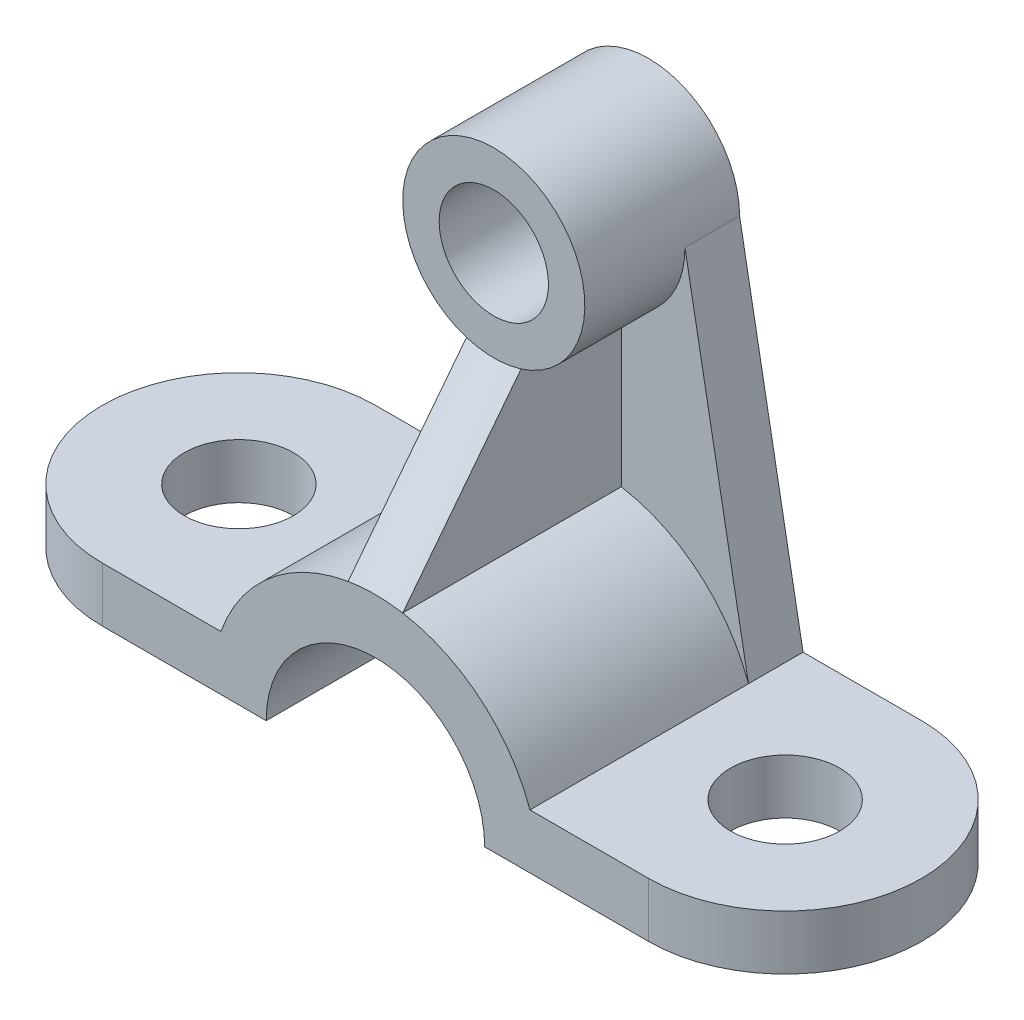
ISO-10303-21;
HEADER;
FILE_DESCRIPTION(('STEP AP214'),'2;1');
FILE_NAME('part.step','',(''),(''),'','','');
FILE_SCHEMA(('AUTOMOTIVE_DESIGN { 1 0 10303 214 1 1 1 1 }'));
ENDSEC;
DATA;
#1=APPLICATION_CONTEXT('core data for automotive mechanical design processes');
#2=APPLICATION_PROTOCOL_DEFINITION('international standard','automotive_design',2000,#1);
#3=PRODUCT_CONTEXT('',#1,'mechanical');
#4=PRODUCT('Part','Part','',(#3));
#5=PRODUCT_RELATED_PRODUCT_CATEGORY('part','',(#4));
#6=PRODUCT_DEFINITION_FORMATION('','',#4);
#7=PRODUCT_DEFINITION_CONTEXT('part definition',#1,'design');
#8=PRODUCT_DEFINITION('design','',#6,#7);
#9=PRODUCT_DEFINITION_SHAPE('','',#8);
#10=(LENGTH_UNIT() NAMED_UNIT(*) SI_UNIT(.MILLI.,.METRE.));
#11=(NAMED_UNIT(*) PLANE_ANGLE_UNIT() SI_UNIT($,.RADIAN.));
#12=(NAMED_UNIT(*) SI_UNIT($,.STERADIAN.) SOLID_ANGLE_UNIT());
#13=UNCERTAINTY_MEASURE_WITH_UNIT(LENGTH_MEASURE(1.E-05),#10,'distance_accuracy_value','');
#14=(GEOMETRIC_REPRESENTATION_CONTEXT(3) GLOBAL_UNCERTAINTY_ASSIGNED_CONTEXT((#13)) GLOBAL_UNIT_ASSIGNED_CONTEXT((#10,
#11,#12)) REPRESENTATION_CONTEXT('',''));
#15=CARTESIAN_POINT('',(0.,0.,0.));
#16=DIRECTION('',(0.,0.,1.));
#17=DIRECTION('',(1.,0.,0.));
#18=AXIS2_PLACEMENT_3D('',#15,#16,#17);
#19=CARTESIAN_POINT('',(0.,0.,-30.));
#20=DIRECTION('',(0.,0.,1.));
#21=DIRECTION('',(1.,0.,0.));
#22=AXIS2_PLACEMENT_3D('',#19,#20,#21);
#23=CYLINDRICAL_SURFACE('',#22,36.);
#24=DIRECTION('',(0.,0.,-1.));
#25=VECTOR('',#24,1.);
#26=CARTESIAN_POINT('',(6.00000000000001,35.4964786985977,39.5135616599253));
#27=LINE('',#26,#25);
#28=CARTESIAN_POINT('',(6.00000000000001,35.4964786985977,4.));
#29=VERTEX_POINT('',#28);
#30=CARTESIAN_POINT('',(6.00000000000001,35.4964786985977,-18.));
#31=VERTEX_POINT('',#30);
#32=EDGE_CURVE('E225',#29,#31,#27,.T.);
#33=ORIENTED_EDGE('',*,*,#32,.F.);
#34=DIRECTION('',(0.,0.,1.));
#35=VECTOR('',#34,1.);
#36=CARTESIAN_POINT('',(6.00000000000001,35.4964786985977,-30.));
#37=LINE('',#36,#35);
#38=CARTESIAN_POINT('',(6.00000000000001,35.4964786985977,30.));
#39=VERTEX_POINT('',#38);
#40=EDGE_CURVE('E12',#29,#39,#37,.T.);
#41=ORIENTED_EDGE('',*,*,#40,.T.);
#42=CARTESIAN_POINT('',(0.,0.,30.));
#43=DIRECTION('',(0.,0.,1.));
#44=DIRECTION('',(1.,0.,0.));
#45=AXIS2_PLACEMENT_3D('',#42,#43,#44);
#46=CIRCLE('',#45,36.);
#47=CARTESIAN_POINT('',(33.9411254969543,12.,30.));
#48=VERTEX_POINT('',#47);
#49=EDGE_CURVE('E302',#48,#39,#46,.T.);
#50=ORIENTED_EDGE('',*,*,#49,.F.);
#51=DIRECTION('',(0.,0.,1.));
#52=VECTOR('',#51,1.);
#53=CARTESIAN_POINT('',(33.9411254969543,12.,-30.));
#54=LINE('',#53,#52);
#55=CARTESIAN_POINT('',(33.9411254969543,12.,-18.));
#56=VERTEX_POINT('',#55);
#57=EDGE_CURVE('E293',#56,#48,#54,.T.);
#58=ORIENTED_EDGE('',*,*,#57,.F.);
#59=CARTESIAN_POINT('',(0.,0.,-18.));
#60=DIRECTION('',(0.,0.,-1.));
#61=DIRECTION('',(-1.,0.,0.));
#62=AXIS2_PLACEMENT_3D('',#59,#60,#61);
#63=CIRCLE('',#62,36.);
#64=EDGE_CURVE('E263',#31,#56,#63,.T.);
#65=ORIENTED_EDGE('',*,*,#64,.F.);
#66=EDGE_LOOP('',(#33,#41,#50,#58,#65));
#67=FACE_BOUND('',#66,.T.);
#68=ADVANCED_FACE('F65',(#67),#23,.T.);
#69=CARTESIAN_POINT('',(-5.99999999999999,35.4964786985977,30.));
#70=VERTEX_POINT('',#69);
#71=CARTESIAN_POINT('',(-33.9411254969543,12.,30.));
#72=VERTEX_POINT('',#71);
#73=EDGE_CURVE('E286',#70,#72,#46,.T.);
#74=ORIENTED_EDGE('',*,*,#73,.F.);
#75=DIRECTION('',(0.,0.,1.));
#76=VECTOR('',#75,1.);
#77=CARTESIAN_POINT('',(-5.99999999999999,35.4964786985977,-30.));
#78=LINE('',#77,#76);
#79=CARTESIAN_POINT('',(-5.99999999999999,35.4964786985977,4.));
#80=VERTEX_POINT('',#79);
#81=EDGE_CURVE('E76',#70,#80,#78,.F.);
#82=ORIENTED_EDGE('',*,*,#81,.T.);
#83=DIRECTION('',(0.,0.,-1.));
#84=VECTOR('',#83,1.);
#85=CARTESIAN_POINT('',(-5.99999999999999,35.4964786985977,39.5135616599253));
#86=LINE('',#85,#84);
#87=CARTESIAN_POINT('',(-5.99999999999999,35.4964786985977,-18.));
#88=VERTEX_POINT('',#87);
#89=EDGE_CURVE('E218',#80,#88,#86,.T.);
#90=ORIENTED_EDGE('',*,*,#89,.T.);
#91=CARTESIAN_POINT('',(-33.9411254969543,12.,-18.));
#92=VERTEX_POINT('',#91);
#93=EDGE_CURVE('E191',#92,#88,#63,.T.);
#94=ORIENTED_EDGE('',*,*,#93,.F.);
#95=DIRECTION('',(0.,0.,1.));
#96=VECTOR('',#95,1.);
#97=CARTESIAN_POINT('',(-33.9411254969543,12.,-30.));
#98=LINE('',#97,#96);
#99=EDGE_CURVE('E694',#92,#72,#98,.T.);
#100=ORIENTED_EDGE('',*,*,#99,.T.);
#101=EDGE_LOOP('',(#74,#82,#90,#94,#100));
#102=FACE_BOUND('',#101,.T.);
#103=ADVANCED_FACE('F385',(#102),#23,.T.);
#104=CARTESIAN_POINT('',(0.,0.,-18.));
#105=DIRECTION('',(0.,0.,-1.));
#106=DIRECTION('',(-1.,0.,0.));
#107=AXIS2_PLACEMENT_3D('',#104,#105,#106);
#108=PLANE('',#107);
#109=DIRECTION('',(0.,1.,0.));
#110=VECTOR('',#109,1.);
#111=CARTESIAN_POINT('',(6.,68.9212159716611,-18.));
#112=LINE('',#111,#110);
#113=CARTESIAN_POINT('',(6.,68.9212159716611,-18.));
#114=VERTEX_POINT('',#113);
#115=EDGE_CURVE('E85',#31,#114,#112,.T.);
#116=ORIENTED_EDGE('',*,*,#115,.F.);
#117=ORIENTED_EDGE('',*,*,#64,.T.);
#118=DIRECTION('',(-0.180425434485843,0.98358866534268,0.));
#119=VECTOR('',#118,1.);
#120=CARTESIAN_POINT('',(34.9658015341946,6.41398193802372,-18.));
#121=LINE('',#120,#119);
#122=CARTESIAN_POINT('',(20.,88.,-18.));
#123=VERTEX_POINT('',#122);
#124=EDGE_CURVE('E259',#56,#123,#121,.T.);
#125=ORIENTED_EDGE('',*,*,#124,.T.);
#126=CARTESIAN_POINT('',(0.,88.,-18.));
#127=DIRECTION('',(0.,0.,-1.));
#128=DIRECTION('',(-1.,0.,0.));
#129=AXIS2_PLACEMENT_3D('',#126,#127,#128);
#130=CIRCLE('',#129,20.);
#131=EDGE_CURVE('E207',#123,#114,#130,.T.);
#132=ORIENTED_EDGE('',*,*,#131,.T.);
#133=EDGE_LOOP('',(#116,#117,#125,#132));
#134=FACE_BOUND('',#133,.T.);
#135=ADVANCED_FACE('F399',(#134),#108,.F.);
#136=DIRECTION('',(0.,-1.,0.));
#137=VECTOR('',#136,1.);
#138=CARTESIAN_POINT('',(-5.99999999999999,35.4964786985977,-18.));
#139=LINE('',#138,#137);
#140=CARTESIAN_POINT('',(-6.,68.9212159716611,-18.));
#141=VERTEX_POINT('',#140);
#142=EDGE_CURVE('E185',#141,#88,#139,.T.);
#143=ORIENTED_EDGE('',*,*,#142,.F.);
#144=CARTESIAN_POINT('',(-20.,88.,-18.));
#145=VERTEX_POINT('',#144);
#146=EDGE_CURVE('E189',#141,#145,#130,.T.);
#147=ORIENTED_EDGE('',*,*,#146,.T.);
#148=DIRECTION('',(0.180425434485843,0.98358866534268,0.));
#149=VECTOR('',#148,1.);
#150=CARTESIAN_POINT('',(-34.9658015341946,6.41398193802373,-18.));
#151=LINE('',#150,#149);
#152=EDGE_CURVE('E266',#92,#145,#151,.T.);
#153=ORIENTED_EDGE('',*,*,#152,.F.);
#154=ORIENTED_EDGE('',*,*,#93,.T.);
#155=EDGE_LOOP('',(#143,#147,#153,#154));
#156=FACE_BOUND('',#155,.T.);
#157=ADVANCED_FACE('F187',(#156),#108,.F.);
#158=CARTESIAN_POINT('',(0.,88.,4.));
#159=DIRECTION('',(0.,0.,-1.));
#160=DIRECTION('',(-1.,0.,0.));
#161=AXIS2_PLACEMENT_3D('',#158,#159,#160);
#162=CYLINDRICAL_SURFACE('',#161,20.);
#163=CARTESIAN_POINT('',(0.,88.,4.));
#164=DIRECTION('',(0.,0.,-1.));
#165=DIRECTION('',(-1.,0.,0.));
#166=AXIS2_PLACEMENT_3D('',#163,#164,#165);
#167=CIRCLE('',#166,20.);
#168=CARTESIAN_POINT('',(-6.,68.9212159716611,4.));
#169=VERTEX_POINT('',#168);
#170=CARTESIAN_POINT('',(6.,68.9212159716611,4.));
#171=VERTEX_POINT('',#170);
#172=EDGE_CURVE('E253',#169,#171,#167,.T.);
#173=ORIENTED_EDGE('',*,*,#172,.T.);
#174=DIRECTION('',(0.,0.,-1.));
#175=VECTOR('',#174,1.);
#176=CARTESIAN_POINT('',(6.,68.9212159716611,39.5135616599253));
#177=LINE('',#176,#175);
#178=EDGE_CURVE('E233',#171,#114,#177,.T.);
#179=ORIENTED_EDGE('',*,*,#178,.T.);
#180=ORIENTED_EDGE('',*,*,#131,.F.);
#181=DIRECTION('',(0.,0.,-1.));
#182=VECTOR('',#181,1.);
#183=CARTESIAN_POINT('',(20.,88.,-18.));
#184=LINE('',#183,#182);
#185=CARTESIAN_POINT('',(20.,88.,-30.));
#186=VERTEX_POINT('',#185);
#187=EDGE_CURVE('E269',#123,#186,#184,.T.);
#188=ORIENTED_EDGE('',*,*,#187,.T.);
#189=CARTESIAN_POINT('',(0.,88.,-30.));
#190=DIRECTION('',(0.,0.,-1.));
#191=DIRECTION('',(-1.,0.,0.));
#192=AXIS2_PLACEMENT_3D('',#189,#190,#191);
#193=CIRCLE('',#192,20.);
#194=CARTESIAN_POINT('',(-20.,88.,-30.));
#195=VERTEX_POINT('',#194);
#196=EDGE_CURVE('E223',#195,#186,#193,.T.);
#197=ORIENTED_EDGE('',*,*,#196,.F.);
#198=DIRECTION('',(0.,0.,-1.));
#199=VECTOR('',#198,1.);
#200=CARTESIAN_POINT('',(-20.,88.,-18.));
#201=LINE('',#200,#199);
#202=EDGE_CURVE('E204',#145,#195,#201,.T.);
#203=ORIENTED_EDGE('',*,*,#202,.F.);
#204=ORIENTED_EDGE('',*,*,#146,.F.);
#205=DIRECTION('',(0.,0.,-1.));
#206=VECTOR('',#205,1.);
#207=CARTESIAN_POINT('',(-6.,68.9212159716611,39.5135616599253));
#208=LINE('',#207,#206);
#209=EDGE_CURVE('E202',#169,#141,#208,.T.);
#210=ORIENTED_EDGE('',*,*,#209,.F.);
#211=EDGE_LOOP('',(#173,#179,#180,#188,#197,#203,#204,#210));
#212=FACE_BOUND('',#211,.T.);
#213=ADVANCED_FACE('F201',(#212),#162,.T.);
#214=CARTESIAN_POINT('',(-60.,0.,0.));
#215=DIRECTION('',(0.,1.,0.));
#216=DIRECTION('',(0.,0.,1.));
#217=AXIS2_PLACEMENT_3D('',#214,#215,#216);
#218=PLANE('',#217);
#219=CARTESIAN_POINT('',(-60.,0.,0.));
#220=DIRECTION('',(0.,1.,0.));
#221=DIRECTION('',(0.,0.,1.));
#222=AXIS2_PLACEMENT_3D('',#219,#220,#221);
#223=CIRCLE('',#222,12.);
#224=CARTESIAN_POINT('',(-60.,0.,12.));
#225=VERTEX_POINT('',#224);
#226=EDGE_CURVE('E681',#225,#225,#223,.T.);
#227=ORIENTED_EDGE('',*,*,#226,.T.);
#228=EDGE_LOOP('',(#227));
#229=FACE_BOUND('',#228,.T.);
#230=DIRECTION('',(-1.,0.,0.));
#231=VECTOR('',#230,1.);
#232=CARTESIAN_POINT('',(0.,0.,-30.));
#233=LINE('',#232,#231);
#234=CARTESIAN_POINT('',(-24.,0.,-30.));
#235=VERTEX_POINT('',#234);
#236=CARTESIAN_POINT('',(-60.,0.,-30.));
#237=VERTEX_POINT('',#236);
#238=EDGE_CURVE('E501',#235,#237,#233,.T.);
#239=ORIENTED_EDGE('',*,*,#238,.F.);
#240=DIRECTION('',(0.,0.,1.));
#241=VECTOR('',#240,1.);
#242=CARTESIAN_POINT('',(-24.,0.,-30.));
#243=LINE('',#242,#241);
#244=CARTESIAN_POINT('',(-24.,0.,30.));
#245=VERTEX_POINT('',#244);
#246=EDGE_CURVE('E282',#235,#245,#243,.T.);
#247=ORIENTED_EDGE('',*,*,#246,.T.);
#248=DIRECTION('',(1.,0.,0.));
#249=VECTOR('',#248,1.);
#250=CARTESIAN_POINT('',(0.,0.,30.));
#251=LINE('',#250,#249);
#252=CARTESIAN_POINT('',(-60.,0.,30.));
#253=VERTEX_POINT('',#252);
#254=EDGE_CURVE('E494',#253,#245,#251,.T.);
#255=ORIENTED_EDGE('',*,*,#254,.F.);
#256=CARTESIAN_POINT('',(-60.,0.,0.));
#257=DIRECTION('',(0.,1.,0.));
#258=DIRECTION('',(0.,0.,1.));
#259=AXIS2_PLACEMENT_3D('',#256,#257,#258);
#260=CIRCLE('',#259,30.);
#261=EDGE_CURVE('E488',#237,#253,#260,.T.);
#262=ORIENTED_EDGE('',*,*,#261,.F.);
#263=EDGE_LOOP('',(#239,#247,#255,#262));
#264=FACE_BOUND('',#263,.T.);
#265=ADVANCED_FACE('F370',(#229,#264),#218,.F.);
#266=CARTESIAN_POINT('',(-60.,12.,0.));
#267=DIRECTION('',(0.,1.,0.));
#268=DIRECTION('',(0.,0.,1.));
#269=AXIS2_PLACEMENT_3D('',#266,#267,#268);
#270=PLANE('',#269);
#271=CARTESIAN_POINT('',(-33.9411254969543,12.,-30.));
#272=VERTEX_POINT('',#271);
#273=EDGE_CURVE('E673',#272,#92,#98,.T.);
#274=ORIENTED_EDGE('',*,*,#273,.F.);
#275=DIRECTION('',(-1.,0.,0.));
#276=VECTOR('',#275,1.);
#277=CARTESIAN_POINT('',(0.,12.,-30.));
#278=LINE('',#277,#276);
#279=CARTESIAN_POINT('',(-60.,12.,-30.));
#280=VERTEX_POINT('',#279);
#281=EDGE_CURVE('E483',#272,#280,#278,.T.);
#282=ORIENTED_EDGE('',*,*,#281,.T.);
#283=CARTESIAN_POINT('',(-60.,12.,0.));
#284=DIRECTION('',(0.,1.,0.));
#285=DIRECTION('',(0.,0.,1.));
#286=AXIS2_PLACEMENT_3D('',#283,#284,#285);
#287=CIRCLE('',#286,30.);
#288=CARTESIAN_POINT('',(-60.,12.,30.));
#289=VERTEX_POINT('',#288);
#290=EDGE_CURVE('E470',#280,#289,#287,.T.);
#291=ORIENTED_EDGE('',*,*,#290,.T.);
#292=DIRECTION('',(1.,0.,0.));
#293=VECTOR('',#292,1.);
#294=CARTESIAN_POINT('',(0.,12.,30.));
#295=LINE('',#294,#293);
#296=EDGE_CURVE('E469',#289,#72,#295,.T.);
#297=ORIENTED_EDGE('',*,*,#296,.T.);
#298=ORIENTED_EDGE('',*,*,#99,.F.);
#299=EDGE_LOOP('',(#274,#282,#291,#297,#298));
#300=FACE_BOUND('',#299,.T.);
#301=CARTESIAN_POINT('',(-60.,12.,0.));
#302=DIRECTION('',(0.,1.,0.));
#303=DIRECTION('',(0.,0.,1.));
#304=AXIS2_PLACEMENT_3D('',#301,#302,#303);
#305=CIRCLE('',#304,12.);
#306=CARTESIAN_POINT('',(-60.,12.,12.));
#307=VERTEX_POINT('',#306);
#308=EDGE_CURVE('E493',#307,#307,#305,.T.);
#309=ORIENTED_EDGE('',*,*,#308,.F.);
#310=EDGE_LOOP('',(#309));
#311=FACE_BOUND('',#310,.T.);
#312=ADVANCED_FACE('F373',(#300,#311),#270,.T.);
#313=CARTESIAN_POINT('',(33.9411254969543,12.,-30.));
#314=VERTEX_POINT('',#313);
#315=EDGE_CURVE('E696',#314,#56,#54,.T.);
#316=ORIENTED_EDGE('',*,*,#315,.T.);
#317=ORIENTED_EDGE('',*,*,#57,.T.);
#318=CARTESIAN_POINT('',(60.,12.,30.));
#319=VERTEX_POINT('',#318);
#320=EDGE_CURVE('E464',#48,#319,#295,.T.);
#321=ORIENTED_EDGE('',*,*,#320,.T.);
#322=CARTESIAN_POINT('',(60.,12.,0.));
#323=DIRECTION('',(0.,1.,0.));
#324=DIRECTION('',(0.,0.,-1.));
#325=AXIS2_PLACEMENT_3D('',#322,#323,#324);
#326=CIRCLE('',#325,30.);
#327=CARTESIAN_POINT('',(60.,12.,-30.));
#328=VERTEX_POINT('',#327);
#329=EDGE_CURVE('E475',#319,#328,#326,.T.);
#330=ORIENTED_EDGE('',*,*,#329,.T.);
#331=EDGE_CURVE('E484',#328,#314,#278,.T.);
#332=ORIENTED_EDGE('',*,*,#331,.T.);
#333=EDGE_LOOP('',(#316,#317,#321,#330,#332));
#334=FACE_BOUND('',#333,.T.);
#335=CARTESIAN_POINT('',(60.,12.,0.));
#336=DIRECTION('',(0.,1.,0.));
#337=DIRECTION('',(0.,0.,1.));
#338=AXIS2_PLACEMENT_3D('',#335,#336,#337);
#339=CIRCLE('',#338,12.);
#340=CARTESIAN_POINT('',(60.,12.,12.));
#341=VERTEX_POINT('',#340);
#342=EDGE_CURVE('E685',#341,#341,#339,.T.);
#343=ORIENTED_EDGE('',*,*,#342,.F.);
#344=EDGE_LOOP('',(#343));
#345=FACE_BOUND('',#344,.T.);
#346=ADVANCED_FACE('F368',(#334,#345),#270,.T.);
#347=CARTESIAN_POINT('',(24.,0.,30.));
#348=VERTEX_POINT('',#347);
#349=CARTESIAN_POINT('',(60.,0.,30.));
#350=VERTEX_POINT('',#349);
#351=EDGE_CURVE('E492',#348,#350,#251,.T.);
#352=ORIENTED_EDGE('',*,*,#351,.F.);
#353=DIRECTION('',(0.,0.,1.));
#354=VECTOR('',#353,1.);
#355=CARTESIAN_POINT('',(24.,0.,-30.));
#356=LINE('',#355,#354);
#357=CARTESIAN_POINT('',(24.,0.,-30.));
#358=VERTEX_POINT('',#357);
#359=EDGE_CURVE('E279',#358,#348,#356,.T.);
#360=ORIENTED_EDGE('',*,*,#359,.F.);
#361=CARTESIAN_POINT('',(60.,0.,-30.));
#362=VERTEX_POINT('',#361);
#363=EDGE_CURVE('E477',#362,#358,#233,.T.);
#364=ORIENTED_EDGE('',*,*,#363,.F.);
#365=CARTESIAN_POINT('',(60.,0.,0.));
#366=DIRECTION('',(0.,1.,0.));
#367=DIRECTION('',(0.,0.,-1.));
#368=AXIS2_PLACEMENT_3D('',#365,#366,#367);
#369=CIRCLE('',#368,30.);
#370=EDGE_CURVE('E497',#350,#362,#369,.T.);
#371=ORIENTED_EDGE('',*,*,#370,.F.);
#372=EDGE_LOOP('',(#352,#360,#364,#371));
#373=FACE_BOUND('',#372,.T.);
#374=CARTESIAN_POINT('',(60.,0.,0.));
#375=DIRECTION('',(0.,1.,0.));
#376=DIRECTION('',(0.,0.,1.));
#377=AXIS2_PLACEMENT_3D('',#374,#375,#376);
#378=CIRCLE('',#377,12.);
#379=CARTESIAN_POINT('',(60.,0.,12.));
#380=VERTEX_POINT('',#379);
#381=EDGE_CURVE('E688',#380,#380,#378,.T.);
#382=ORIENTED_EDGE('',*,*,#381,.T.);
#383=EDGE_LOOP('',(#382));
#384=FACE_BOUND('',#383,.T.);
#385=ADVANCED_FACE('F365',(#373,#384),#218,.F.);
#386=CARTESIAN_POINT('',(-60.,12.,0.));
#387=DIRECTION('',(0.,-1.,0.));
#388=DIRECTION('',(0.,0.,-1.));
#389=AXIS2_PLACEMENT_3D('',#386,#387,#388);
#390=CYLINDRICAL_SURFACE('',#389,30.);
#391=ORIENTED_EDGE('',*,*,#261,.T.);
#392=DIRECTION('',(0.,-1.,0.));
#393=VECTOR('',#392,1.);
#394=CARTESIAN_POINT('',(-60.,12.,30.));
#395=LINE('',#394,#393);
#396=EDGE_CURVE('E514',#289,#253,#395,.T.);
#397=ORIENTED_EDGE('',*,*,#396,.F.);
#398=ORIENTED_EDGE('',*,*,#290,.F.);
#399=DIRECTION('',(0.,-1.,0.));
#400=VECTOR('',#399,1.);
#401=CARTESIAN_POINT('',(-60.,12.,-30.));
#402=LINE('',#401,#400);
#403=EDGE_CURVE('E487',#280,#237,#402,.T.);
#404=ORIENTED_EDGE('',*,*,#403,.T.);
#405=EDGE_LOOP('',(#391,#397,#398,#404));
#406=FACE_BOUND('',#405,.T.);
#407=ADVANCED_FACE('F67',(#406),#390,.T.);
#408=CARTESIAN_POINT('',(0.,12.,30.));
#409=DIRECTION('',(0.,0.,-1.));
#410=DIRECTION('',(-1.,0.,0.));
#411=AXIS2_PLACEMENT_3D('',#408,#409,#410);
#412=PLANE('',#411);
#413=ORIENTED_EDGE('',*,*,#254,.T.);
#414=CARTESIAN_POINT('',(0.,0.,30.));
#415=DIRECTION('',(0.,0.,1.));
#416=DIRECTION('',(1.,0.,0.));
#417=AXIS2_PLACEMENT_3D('',#414,#415,#416);
#418=CIRCLE('',#417,24.);
#419=EDGE_CURVE('E294',#348,#245,#418,.T.);
#420=ORIENTED_EDGE('',*,*,#419,.F.);
#421=ORIENTED_EDGE('',*,*,#351,.T.);
#422=DIRECTION('',(0.,-1.,0.));
#423=VECTOR('',#422,1.);
#424=CARTESIAN_POINT('',(60.,12.,30.));
#425=LINE('',#424,#423);
#426=EDGE_CURVE('E466',#319,#350,#425,.T.);
#427=ORIENTED_EDGE('',*,*,#426,.F.);
#428=ORIENTED_EDGE('',*,*,#320,.F.);
#429=ORIENTED_EDGE('',*,*,#49,.T.);
#430=CARTESIAN_POINT('',(6.00000000000001,35.4964786985977,30.));
#431=CARTESIAN_POINT('',(5.49322327185701,35.5821248647535,30.));
#432=CARTESIAN_POINT('',(4.98460898998446,35.65686970159,30.));
#433=CARTESIAN_POINT('',(3.96475876102225,35.784518452821,30.));
#434=CARTESIAN_POINT('',(3.45352340836398,35.8374271152967,30.));
#435=CARTESIAN_POINT('',(2.42923617793145,35.9214047516096,30.));
#436=CARTESIAN_POINT('',(1.91618420588644,35.9524725748474,30.));
#437=CARTESIAN_POINT('',(0.889164465858613,35.9926308830075,30.));
#438=CARTESIAN_POINT('',(0.375196610452707,36.0017191435336,30.));
#439=CARTESIAN_POINT('',(-0.62927171903508,35.9978331911425,30.));
#440=CARTESIAN_POINT('',(-1.11977628908177,35.9858436666283,30.));
#441=CARTESIAN_POINT('',(-2.09993976899148,35.9418617781954,30.));
#442=CARTESIAN_POINT('',(-2.58959858240823,35.9098672668564,30.));
#443=CARTESIAN_POINT('',(-3.56762228694819,35.8259355818239,30.));
#444=CARTESIAN_POINT('',(-4.05598573180674,35.7739815487646,30.));
#445=CARTESIAN_POINT('',(-5.03012493767186,35.6501592559403,30.));
#446=CARTESIAN_POINT('',(-5.5159009842514,35.5782932423256,30.));
#447=CARTESIAN_POINT('',(-5.99999999999999,35.4964786985977,30.));
#448=B_SPLINE_CURVE_WITH_KNOTS('',3,(#430,#431,#432,#433,#434,#435,#436,#437,#438,#439,#440,
#441,#442,#443,#444,#445,#446,#447),.UNSPECIFIED.,.F.,.F.,(4,2,2,2,2,2,2,2,4),(0.,
1.54176332978533,3.08319124004811,4.62470034833632,6.16636545533117,7.63790942288605,
9.1096113793532,10.5825591928217,12.055340919554),.UNSPECIFIED.);
#449=EDGE_CURVE('E306',#39,#70,#448,.T.);
#450=ORIENTED_EDGE('',*,*,#449,.T.);
#451=ORIENTED_EDGE('',*,*,#73,.T.);
#452=ORIENTED_EDGE('',*,*,#296,.F.);
#453=ORIENTED_EDGE('',*,*,#396,.T.);
#454=EDGE_LOOP('',(#413,#420,#421,#427,#428,#429,#450,#451,#452,#453));
#455=FACE_BOUND('',#454,.T.);
#456=ADVANCED_FACE('F351',(#455),#412,.F.);
#457=CARTESIAN_POINT('',(60.,12.,0.));
#458=DIRECTION('',(0.,-1.,0.));
#459=DIRECTION('',(0.,0.,-1.));
#460=AXIS2_PLACEMENT_3D('',#457,#458,#459);
#461=CYLINDRICAL_SURFACE('',#460,30.);
#462=ORIENTED_EDGE('',*,*,#370,.T.);
#463=DIRECTION('',(0.,-1.,0.));
#464=VECTOR('',#463,1.);
#465=CARTESIAN_POINT('',(60.,12.,-30.));
#466=LINE('',#465,#464);
#467=EDGE_CURVE('E508',#328,#362,#466,.T.);
#468=ORIENTED_EDGE('',*,*,#467,.F.);
#469=ORIENTED_EDGE('',*,*,#329,.F.);
#470=ORIENTED_EDGE('',*,*,#426,.T.);
#471=EDGE_LOOP('',(#462,#468,#469,#470));
#472=FACE_BOUND('',#471,.T.);
#473=ADVANCED_FACE('F355',(#472),#461,.T.);
#474=CARTESIAN_POINT('',(0.,12.,-30.));
#475=DIRECTION('',(0.,0.,1.));
#476=DIRECTION('',(1.,0.,0.));
#477=AXIS2_PLACEMENT_3D('',#474,#475,#476);
#478=PLANE('',#477);
#479=ORIENTED_EDGE('',*,*,#363,.T.);
#480=CARTESIAN_POINT('',(0.,0.,-30.));
#481=DIRECTION('',(0.,0.,1.));
#482=DIRECTION('',(1.,0.,0.));
#483=AXIS2_PLACEMENT_3D('',#480,#481,#482);
#484=CIRCLE('',#483,24.);
#485=EDGE_CURVE('E290',#358,#235,#484,.T.);
#486=ORIENTED_EDGE('',*,*,#485,.T.);
#487=ORIENTED_EDGE('',*,*,#238,.T.);
#488=ORIENTED_EDGE('',*,*,#403,.F.);
#489=ORIENTED_EDGE('',*,*,#281,.F.);
#490=DIRECTION('',(0.180425434485843,0.98358866534268,0.));
#491=VECTOR('',#490,1.);
#492=CARTESIAN_POINT('',(-34.9658015341946,6.41398193802373,-30.));
#493=LINE('',#492,#491);
#494=EDGE_CURVE('E208',#272,#195,#493,.T.);
#495=ORIENTED_EDGE('',*,*,#494,.T.);
#496=ORIENTED_EDGE('',*,*,#196,.T.);
#497=DIRECTION('',(-0.180425434485843,0.98358866534268,0.));
#498=VECTOR('',#497,1.);
#499=CARTESIAN_POINT('',(34.9658015341946,6.41398193802372,-30.));
#500=LINE('',#499,#498);
#501=EDGE_CURVE('E270',#314,#186,#500,.T.);
#502=ORIENTED_EDGE('',*,*,#501,.F.);
#503=ORIENTED_EDGE('',*,*,#331,.F.);
#504=ORIENTED_EDGE('',*,*,#467,.T.);
#505=EDGE_LOOP('',(#479,#486,#487,#488,#489,#495,#496,#502,#503,#504));
#506=FACE_BOUND('',#505,.T.);
#507=CARTESIAN_POINT('',(0.,88.,-30.));
#508=DIRECTION('',(0.,0.,-1.));
#509=DIRECTION('',(-1.,0.,0.));
#510=AXIS2_PLACEMENT_3D('',#507,#508,#509);
#511=CIRCLE('',#510,12.);
#512=CARTESIAN_POINT('',(-12.,88.,-30.));
#513=VERTEX_POINT('',#512);
#514=EDGE_CURVE('E217',#513,#513,#511,.T.);
#515=ORIENTED_EDGE('',*,*,#514,.F.);
#516=EDGE_LOOP('',(#515));
#517=FACE_BOUND('',#516,.T.);
#518=ADVANCED_FACE('F359',(#506,#517),#478,.F.);
#519=CARTESIAN_POINT('',(-60.,12.,0.));
#520=DIRECTION('',(0.,-1.,0.));
#521=DIRECTION('',(0.,0.,-1.));
#522=AXIS2_PLACEMENT_3D('',#519,#520,#521);
#523=CYLINDRICAL_SURFACE('',#522,12.);
#524=ORIENTED_EDGE('',*,*,#308,.T.);
#525=EDGE_LOOP('',(#524));
#526=FACE_BOUND('',#525,.T.);
#527=ORIENTED_EDGE('',*,*,#226,.F.);
#528=EDGE_LOOP('',(#527));
#529=FACE_BOUND('',#528,.T.);
#530=ADVANCED_FACE('F363',(#526,#529),#523,.F.);
#531=CARTESIAN_POINT('',(60.,12.,0.));
#532=DIRECTION('',(0.,-1.,0.));
#533=DIRECTION('',(0.,0.,-1.));
#534=AXIS2_PLACEMENT_3D('',#531,#532,#533);
#535=CYLINDRICAL_SURFACE('',#534,12.);
#536=ORIENTED_EDGE('',*,*,#342,.T.);
#537=EDGE_LOOP('',(#536));
#538=FACE_BOUND('',#537,.T.);
#539=ORIENTED_EDGE('',*,*,#381,.F.);
#540=EDGE_LOOP('',(#539));
#541=FACE_BOUND('',#540,.T.);
#542=ADVANCED_FACE('F377',(#538,#541),#535,.F.);
#543=CARTESIAN_POINT('',(0.,0.,-30.));
#544=DIRECTION('',(0.,0.,1.));
#545=DIRECTION('',(1.,0.,0.));
#546=AXIS2_PLACEMENT_3D('',#543,#544,#545);
#547=CYLINDRICAL_SURFACE('',#546,24.);
#548=ORIENTED_EDGE('',*,*,#419,.T.);
#549=ORIENTED_EDGE('',*,*,#246,.F.);
#550=ORIENTED_EDGE('',*,*,#485,.F.);
#551=ORIENTED_EDGE('',*,*,#359,.T.);
#552=EDGE_LOOP('',(#548,#549,#550,#551));
#553=FACE_BOUND('',#552,.T.);
#554=ADVANCED_FACE('F381',(#553),#547,.F.);
#555=CARTESIAN_POINT('',(-34.9658015341946,6.41398193802373,-18.));
#556=DIRECTION('',(-0.98358866534268,0.180425434485843,0.));
#557=DIRECTION('',(-0.180425434485843,-0.98358866534268,0.));
#558=AXIS2_PLACEMENT_3D('',#555,#556,#557);
#559=PLANE('',#558);
#560=ORIENTED_EDGE('',*,*,#494,.F.);
#561=ORIENTED_EDGE('',*,*,#273,.T.);
#562=ORIENTED_EDGE('',*,*,#152,.T.);
#563=ORIENTED_EDGE('',*,*,#202,.T.);
#564=EDGE_LOOP('',(#560,#561,#562,#563));
#565=FACE_BOUND('',#564,.T.);
#566=ADVANCED_FACE('F389',(#565),#559,.T.);
#567=CARTESIAN_POINT('',(34.9658015341946,6.41398193802372,-18.));
#568=DIRECTION('',(-0.98358866534268,-0.180425434485843,0.));
#569=DIRECTION('',(0.180425434485843,-0.98358866534268,0.));
#570=AXIS2_PLACEMENT_3D('',#567,#568,#569);
#571=PLANE('',#570);
#572=ORIENTED_EDGE('',*,*,#501,.T.);
#573=ORIENTED_EDGE('',*,*,#187,.F.);
#574=ORIENTED_EDGE('',*,*,#124,.F.);
#575=ORIENTED_EDGE('',*,*,#315,.F.);
#576=EDGE_LOOP('',(#572,#573,#574,#575));
#577=FACE_BOUND('',#576,.T.);
#578=ADVANCED_FACE('F391',(#577),#571,.F.);
#579=CARTESIAN_POINT('',(0.,88.,4.));
#580=DIRECTION('',(0.,0.,-1.));
#581=DIRECTION('',(-1.,0.,0.));
#582=AXIS2_PLACEMENT_3D('',#579,#580,#581);
#583=CYLINDRICAL_SURFACE('',#582,12.);
#584=CARTESIAN_POINT('',(0.,88.,4.));
#585=DIRECTION('',(0.,0.,-1.));
#586=DIRECTION('',(-1.,0.,0.));
#587=AXIS2_PLACEMENT_3D('',#584,#585,#586);
#588=CIRCLE('',#587,12.);
#589=CARTESIAN_POINT('',(-12.,88.,4.));
#590=VERTEX_POINT('',#589);
#591=EDGE_CURVE('E250',#590,#590,#588,.T.);
#592=ORIENTED_EDGE('',*,*,#591,.F.);
#593=EDGE_LOOP('',(#592));
#594=FACE_BOUND('',#593,.T.);
#595=ORIENTED_EDGE('',*,*,#514,.T.);
#596=EDGE_LOOP('',(#595));
#597=FACE_BOUND('',#596,.T.);
#598=ADVANCED_FACE('F394',(#594,#597),#583,.F.);
#599=CARTESIAN_POINT('',(0.,0.,4.));
#600=DIRECTION('',(0.,0.,-1.));
#601=DIRECTION('',(-1.,0.,0.));
#602=AXIS2_PLACEMENT_3D('',#599,#600,#601);
#603=PLANE('',#602);
#604=ORIENTED_EDGE('',*,*,#591,.T.);
#605=EDGE_LOOP('',(#604));
#606=FACE_BOUND('',#605,.T.);
#607=ORIENTED_EDGE('',*,*,#172,.F.);
#608=CARTESIAN_POINT('',(0.,88.,4.));
#609=DIRECTION('',(0.,0.,-1.));
#610=DIRECTION('',(1.,0.,0.));
#611=AXIS2_PLACEMENT_3D('',#608,#609,#610);
#612=CIRCLE('',#611,20.);
#613=EDGE_CURVE('E196',#171,#169,#612,.T.);
#614=ORIENTED_EDGE('',*,*,#613,.F.);
#615=EDGE_LOOP('',(#607,#614));
#616=FACE_BOUND('',#615,.T.);
#617=ADVANCED_FACE('F323',(#606,#616),#603,.F.);
#618=CARTESIAN_POINT('',(6.,68.9212159716611,39.5135616599253));
#619=DIRECTION('',(-1.,0.,0.));
#620=DIRECTION('',(0.,-1.,0.));
#621=AXIS2_PLACEMENT_3D('',#618,#619,#620);
#622=PLANE('',#621);
#623=ORIENTED_EDGE('',*,*,#178,.F.);
#624=DIRECTION('',(0.,0.78931808849734,-0.613984490985648));
#625=VECTOR('',#624,1.);
#626=CARTESIAN_POINT('',(6.,52.2088473351294,17.));
#627=LINE('',#626,#625);
#628=EDGE_CURVE('E104',#39,#171,#627,.T.);
#629=ORIENTED_EDGE('',*,*,#628,.F.);
#630=ORIENTED_EDGE('',*,*,#40,.F.);
#631=ORIENTED_EDGE('',*,*,#32,.T.);
#632=ORIENTED_EDGE('',*,*,#115,.T.);
#633=EDGE_LOOP('',(#623,#629,#630,#631,#632));
#634=FACE_BOUND('',#633,.T.);
#635=ADVANCED_FACE('F314',(#634),#622,.F.);
#636=CARTESIAN_POINT('',(-5.99999999999999,35.4964786985977,39.5135616599253));
#637=DIRECTION('',(1.,0.,0.));
#638=DIRECTION('',(0.,1.,0.));
#639=AXIS2_PLACEMENT_3D('',#636,#637,#638);
#640=PLANE('',#639);
#641=ORIENTED_EDGE('',*,*,#89,.F.);
#642=ORIENTED_EDGE('',*,*,#81,.F.);
#643=DIRECTION('',(0.,-0.78931808849734,0.613984490985648));
#644=VECTOR('',#643,1.);
#645=CARTESIAN_POINT('',(-5.99999999999999,52.2088473351294,17.));
#646=LINE('',#645,#644);
#647=EDGE_CURVE('E213',#169,#70,#646,.T.);
#648=ORIENTED_EDGE('',*,*,#647,.F.);
#649=ORIENTED_EDGE('',*,*,#209,.T.);
#650=ORIENTED_EDGE('',*,*,#142,.T.);
#651=EDGE_LOOP('',(#641,#642,#648,#649,#650));
#652=FACE_BOUND('',#651,.T.);
#653=ADVANCED_FACE('F211',(#652),#640,.F.);
#654=CARTESIAN_POINT('',(-5.99999999999999,35.4964786985977,30.));
#655=CARTESIAN_POINT('',(-6.,68.9212159716611,4.));
#656=CARTESIAN_POINT('',(-5.01398670281672,35.6631453652644,30.));
#657=CARTESIAN_POINT('',(-5.04606079858305,68.621215971661,4.));
#658=CARTESIAN_POINT('',(-4.01750800421902,35.7890256906149,30.));
#659=CARTESIAN_POINT('',(-4.05838202353978,68.3896711637321,4.));
#660=CARTESIAN_POINT('',(-2.01403595421296,35.9574530079828,30.));
#661=CARTESIAN_POINT('',(-2.04707633434004,68.0790326490671,4.));
#662=CARTESIAN_POINT('',(-1.0070426028046,36.,30.));
#663=CARTESIAN_POINT('',(-1.02357330184565,68.,4.));
#664=CARTESIAN_POINT('',(1.00704260280462,36.,30.));
#665=CARTESIAN_POINT('',(1.02357330184565,68.,4.));
#666=CARTESIAN_POINT('',(2.01403595421298,35.9574530079828,30.));
#667=CARTESIAN_POINT('',(2.04707633434005,68.0790326490671,4.));
#668=CARTESIAN_POINT('',(4.01750800421904,35.7890256906149,30.));
#669=CARTESIAN_POINT('',(4.05838202353978,68.3896711637321,4.));
#670=CARTESIAN_POINT('',(5.01398670281674,35.6631453652644,30.));
#671=CARTESIAN_POINT('',(5.04606079858305,68.6212159716611,4.));
#672=CARTESIAN_POINT('',(6.00000000000001,35.4964786985977,30.));
#673=CARTESIAN_POINT('',(6.,68.9212159716611,4.));
#674=B_SPLINE_SURFACE_WITH_KNOTS('',3,1,((#654,#655),(#656,#657),(#658,#659),(#660,#661),(#662,
#663),(#664,#665),(#666,#667),(#668,#669),(#670,#671),(#672,#673)),.UNSPECIFIED.,.F.,.F.,.F.,(4,
2,2,2,4),(2,2),(0.,0.25,0.5,0.75,1.),(0.,1.),.UNSPECIFIED.);
#675=ORIENTED_EDGE('',*,*,#449,.F.);
#676=ORIENTED_EDGE('',*,*,#628,.T.);
#677=ORIENTED_EDGE('',*,*,#613,.T.);
#678=ORIENTED_EDGE('',*,*,#647,.T.);
#679=EDGE_LOOP('',(#675,#676,#677,#678));
#680=FACE_BOUND('',#679,.T.);
#681=ADVANCED_FACE('F324',(#680),#674,.T.);
#682=CLOSED_SHELL('',(#68,#103,#135,#157,#213,#265,#312,#346,#385,#407,#456,#473,#518,#530,#542,
#554,#566,#578,#598,#617,#635,#653,#681));
#683=MANIFOLD_SOLID_BREP('B2',#682);
#684=ADVANCED_BREP_SHAPE_REPRESENTATION('',(#18,#683),#14);
#685=SHAPE_DEFINITION_REPRESENTATION(#9,#684);
ENDSEC;
END-ISO-10303-21;
